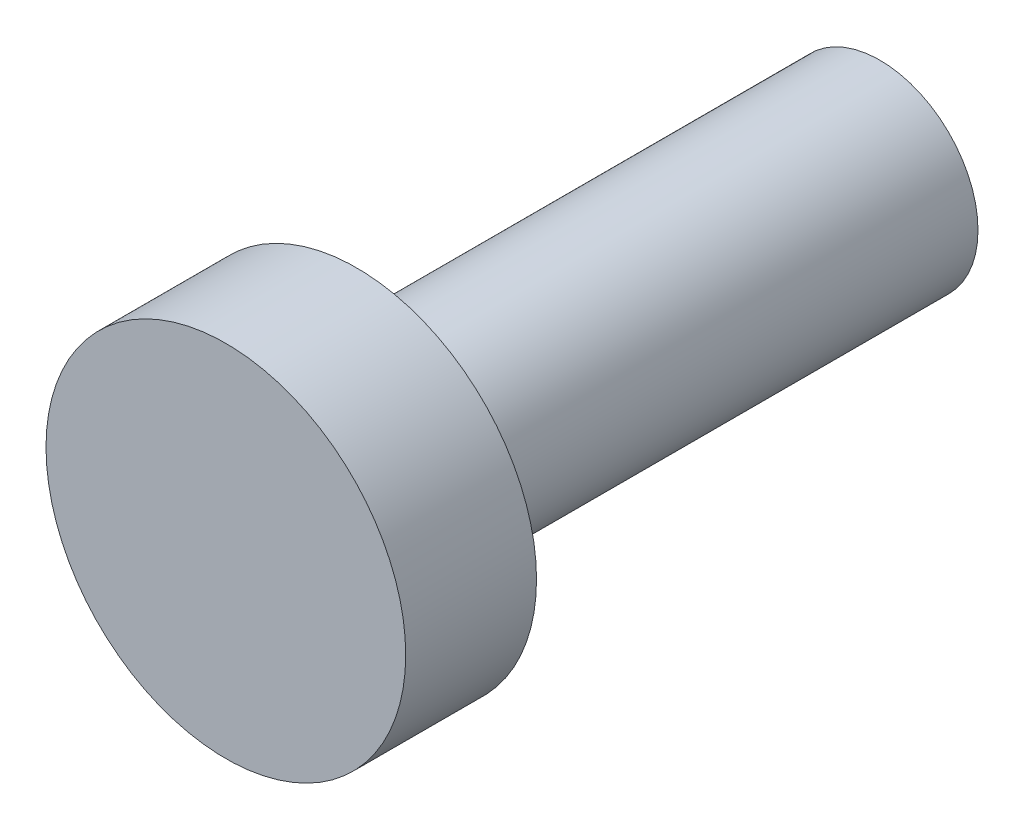
ISO-10303-21;
HEADER;
FILE_DESCRIPTION(('STEP AP214'),'2;1');
FILE_NAME('part.step','',(''),(''),'','','');
FILE_SCHEMA(('AUTOMOTIVE_DESIGN { 1 0 10303 214 1 1 1 1 }'));
ENDSEC;
DATA;
#1=APPLICATION_CONTEXT('core data for automotive mechanical design processes');
#2=APPLICATION_PROTOCOL_DEFINITION('international standard','automotive_design',2000,#1);
#3=PRODUCT_CONTEXT('',#1,'mechanical');
#4=PRODUCT('Part','Part','',(#3));
#5=PRODUCT_RELATED_PRODUCT_CATEGORY('part','',(#4));
#6=PRODUCT_DEFINITION_FORMATION('','',#4);
#7=PRODUCT_DEFINITION_CONTEXT('part definition',#1,'design');
#8=PRODUCT_DEFINITION('design','',#6,#7);
#9=PRODUCT_DEFINITION_SHAPE('','',#8);
#10=(LENGTH_UNIT() NAMED_UNIT(*) SI_UNIT(.MILLI.,.METRE.));
#11=(NAMED_UNIT(*) PLANE_ANGLE_UNIT() SI_UNIT($,.RADIAN.));
#12=(NAMED_UNIT(*) SI_UNIT($,.STERADIAN.) SOLID_ANGLE_UNIT());
#13=UNCERTAINTY_MEASURE_WITH_UNIT(LENGTH_MEASURE(1.E-05),#10,'distance_accuracy_value','');
#14=(GEOMETRIC_REPRESENTATION_CONTEXT(3) GLOBAL_UNCERTAINTY_ASSIGNED_CONTEXT((#13)) GLOBAL_UNIT_ASSIGNED_CONTEXT((#10,
#11,#12)) REPRESENTATION_CONTEXT('',''));
#15=CARTESIAN_POINT('',(0.,0.,0.));
#16=DIRECTION('',(0.,0.,1.));
#17=DIRECTION('',(1.,0.,0.));
#18=AXIS2_PLACEMENT_3D('',#15,#16,#17);
#19=CARTESIAN_POINT('',(0.,0.,0.));
#20=DIRECTION('',(0.,0.,-1.));
#21=DIRECTION('',(-1.,0.,0.));
#22=AXIS2_PLACEMENT_3D('',#19,#20,#21);
#23=CYLINDRICAL_SURFACE('',#22,1.5);
#24=CARTESIAN_POINT('',(0.,0.,0.));
#25=DIRECTION('',(0.,0.,1.));
#26=DIRECTION('',(1.,0.,0.));
#27=AXIS2_PLACEMENT_3D('',#24,#25,#26);
#28=CIRCLE('',#27,1.5);
#29=CARTESIAN_POINT('',(1.5,0.,0.));
#30=VERTEX_POINT('',#29);
#31=EDGE_CURVE('E10',#30,#30,#28,.T.);
#32=ORIENTED_EDGE('',*,*,#31,.F.);
#33=EDGE_LOOP('',(#32));
#34=FACE_BOUND('',#33,.T.);
#35=CARTESIAN_POINT('',(0.,0.,-8.));
#36=DIRECTION('',(0.,0.,1.));
#37=DIRECTION('',(1.,0.,0.));
#38=AXIS2_PLACEMENT_3D('',#35,#36,#37);
#39=CIRCLE('',#38,1.5);
#40=CARTESIAN_POINT('',(1.5,0.,-8.));
#41=VERTEX_POINT('',#40);
#42=EDGE_CURVE('E42',#41,#41,#39,.T.);
#43=ORIENTED_EDGE('',*,*,#42,.T.);
#44=EDGE_LOOP('',(#43));
#45=FACE_BOUND('',#44,.T.);
#46=ADVANCED_FACE('F41',(#34,#45),#23,.T.);
#47=CARTESIAN_POINT('',(0.,0.,-8.));
#48=DIRECTION('',(0.,0.,1.));
#49=DIRECTION('',(1.,0.,0.));
#50=AXIS2_PLACEMENT_3D('',#47,#48,#49);
#51=PLANE('',#50);
#52=ORIENTED_EDGE('',*,*,#42,.F.);
#53=EDGE_LOOP('',(#52));
#54=FACE_BOUND('',#53,.T.);
#55=ADVANCED_FACE('F62',(#54),#51,.F.);
#56=CARTESIAN_POINT('',(0.,0.,2.));
#57=DIRECTION('',(0.,0.,-1.));
#58=DIRECTION('',(-1.,0.,0.));
#59=AXIS2_PLACEMENT_3D('',#56,#57,#58);
#60=CYLINDRICAL_SURFACE('',#59,2.75);
#61=CARTESIAN_POINT('',(0.,0.,2.));
#62=DIRECTION('',(0.,0.,1.));
#63=DIRECTION('',(1.,0.,0.));
#64=AXIS2_PLACEMENT_3D('',#61,#62,#63);
#65=CIRCLE('',#64,2.75);
#66=CARTESIAN_POINT('',(2.75,0.,2.));
#67=VERTEX_POINT('',#66);
#68=EDGE_CURVE('E51',#67,#67,#65,.T.);
#69=ORIENTED_EDGE('',*,*,#68,.F.);
#70=EDGE_LOOP('',(#69));
#71=FACE_BOUND('',#70,.T.);
#72=CARTESIAN_POINT('',(0.,0.,0.));
#73=DIRECTION('',(0.,0.,1.));
#74=DIRECTION('',(1.,0.,0.));
#75=AXIS2_PLACEMENT_3D('',#72,#73,#74);
#76=CIRCLE('',#75,2.75);
#77=CARTESIAN_POINT('',(2.75,0.,0.));
#78=VERTEX_POINT('',#77);
#79=EDGE_CURVE('E52',#78,#78,#76,.T.);
#80=ORIENTED_EDGE('',*,*,#79,.T.);
#81=EDGE_LOOP('',(#80));
#82=FACE_BOUND('',#81,.T.);
#83=ADVANCED_FACE('F63',(#71,#82),#60,.T.);
#84=CARTESIAN_POINT('',(0.,0.,2.));
#85=DIRECTION('',(0.,0.,1.));
#86=DIRECTION('',(1.,0.,0.));
#87=AXIS2_PLACEMENT_3D('',#84,#85,#86);
#88=PLANE('',#87);
#89=ORIENTED_EDGE('',*,*,#68,.T.);
#90=EDGE_LOOP('',(#89));
#91=FACE_BOUND('',#90,.T.);
#92=ADVANCED_FACE('F56',(#91),#88,.T.);
#93=CARTESIAN_POINT('',(0.,0.,0.));
#94=DIRECTION('',(0.,0.,1.));
#95=DIRECTION('',(1.,0.,0.));
#96=AXIS2_PLACEMENT_3D('',#93,#94,#95);
#97=PLANE('',#96);
#98=ORIENTED_EDGE('',*,*,#31,.T.);
#99=EDGE_LOOP('',(#98));
#100=FACE_BOUND('',#99,.T.);
#101=ORIENTED_EDGE('',*,*,#79,.F.);
#102=EDGE_LOOP('',(#101));
#103=FACE_BOUND('',#102,.T.);
#104=ADVANCED_FACE('F66',(#100,#103),#97,.F.);
#105=CLOSED_SHELL('',(#46,#55,#83,#92,#104));
#106=MANIFOLD_SOLID_BREP('B2',#105);
#107=ADVANCED_BREP_SHAPE_REPRESENTATION('',(#18,#106),#14);
#108=SHAPE_DEFINITION_REPRESENTATION(#9,#107);
ENDSEC;
END-ISO-10303-21;
